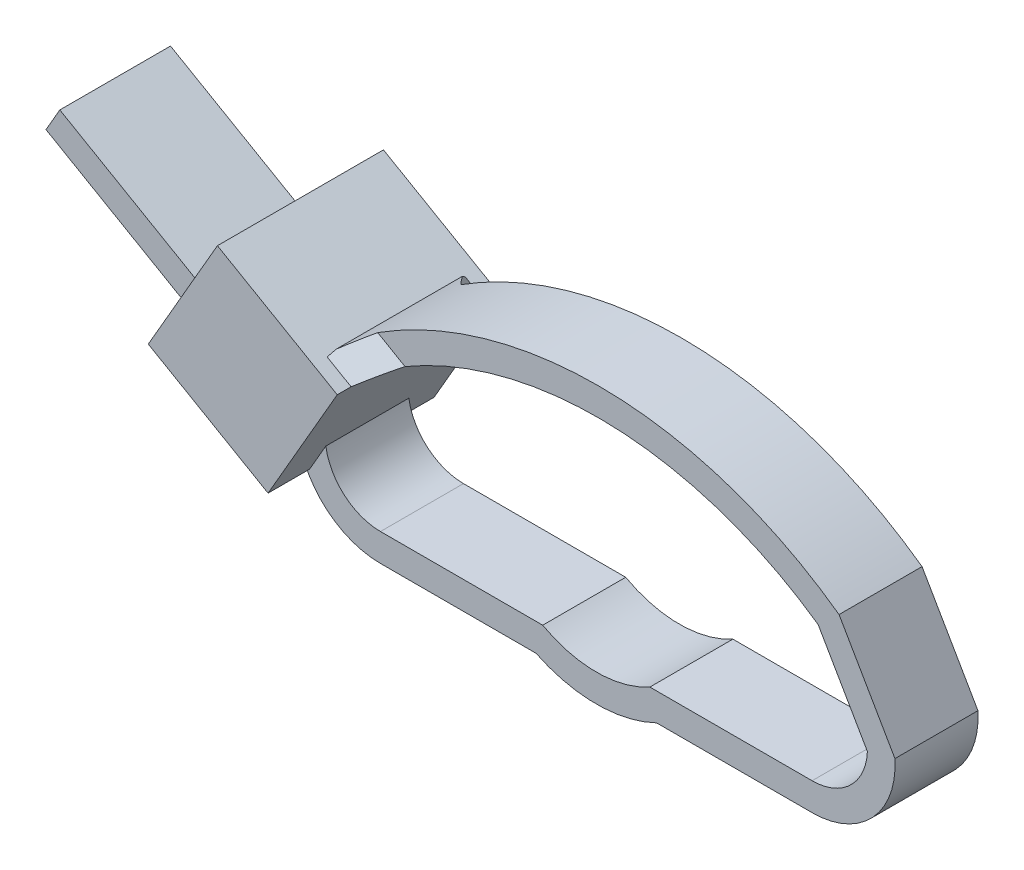
ISO-10303-21;
HEADER;
FILE_DESCRIPTION(('STEP AP214'),'2;1');
FILE_NAME('part.step','',(''),(''),'','','');
FILE_SCHEMA(('AUTOMOTIVE_DESIGN { 1 0 10303 214 1 1 1 1 }'));
ENDSEC;
DATA;
#1=APPLICATION_CONTEXT('core data for automotive mechanical design processes');
#2=APPLICATION_PROTOCOL_DEFINITION('international standard','automotive_design',2000,#1);
#3=PRODUCT_CONTEXT('',#1,'mechanical');
#4=PRODUCT('Part','Part','',(#3));
#5=PRODUCT_RELATED_PRODUCT_CATEGORY('part','',(#4));
#6=PRODUCT_DEFINITION_FORMATION('','',#4);
#7=PRODUCT_DEFINITION_CONTEXT('part definition',#1,'design');
#8=PRODUCT_DEFINITION('design','',#6,#7);
#9=PRODUCT_DEFINITION_SHAPE('','',#8);
#10=(LENGTH_UNIT() NAMED_UNIT(*) SI_UNIT(.MILLI.,.METRE.));
#11=(NAMED_UNIT(*) PLANE_ANGLE_UNIT() SI_UNIT($,.RADIAN.));
#12=(NAMED_UNIT(*) SI_UNIT($,.STERADIAN.) SOLID_ANGLE_UNIT());
#13=UNCERTAINTY_MEASURE_WITH_UNIT(LENGTH_MEASURE(1.E-05),#10,'distance_accuracy_value','');
#14=(GEOMETRIC_REPRESENTATION_CONTEXT(3) GLOBAL_UNCERTAINTY_ASSIGNED_CONTEXT((#13)) GLOBAL_UNIT_ASSIGNED_CONTEXT((#10,
#11,#12)) REPRESENTATION_CONTEXT('',''));
#15=CARTESIAN_POINT('',(0.,0.,0.));
#16=DIRECTION('',(0.,0.,1.));
#17=DIRECTION('',(1.,0.,0.));
#18=AXIS2_PLACEMENT_3D('',#15,#16,#17);
#19=CARTESIAN_POINT('',(-15.4229128114991,8.90442286340706,3.));
#20=DIRECTION('',(0.866025403784441,-0.499999999999996,0.));
#21=DIRECTION('',(0.499999999999996,0.866025403784441,0.));
#22=AXIS2_PLACEMENT_3D('',#19,#20,#21);
#23=PLANE('',#22);
#24=DIRECTION('',(-0.499999999999996,-0.866025403784441,0.));
#25=VECTOR('',#24,1.);
#26=CARTESIAN_POINT('',(-15.4229128114991,8.90442286340706,-3.));
#27=LINE('',#26,#25);
#28=CARTESIAN_POINT('',(-12.1923048454154,14.5000000000009,-3.));
#29=VERTEX_POINT('',#28);
#30=CARTESIAN_POINT('',(-14.6923048454154,10.1698729810787,-3.));
#31=VERTEX_POINT('',#30);
#32=EDGE_CURVE('E346',#29,#31,#27,.T.);
#33=ORIENTED_EDGE('',*,*,#32,.T.);
#34=DIRECTION('',(0.,0.,-1.));
#35=VECTOR('',#34,1.);
#36=CARTESIAN_POINT('',(-14.6923048454154,10.1698729810787,3.));
#37=LINE('',#36,#35);
#38=CARTESIAN_POINT('',(-14.6923048454154,10.1698729810787,3.));
#39=VERTEX_POINT('',#38);
#40=EDGE_CURVE('E355',#39,#31,#37,.T.);
#41=ORIENTED_EDGE('',*,*,#40,.F.);
#42=DIRECTION('',(-0.499999999999996,-0.866025403784441,0.));
#43=VECTOR('',#42,1.);
#44=CARTESIAN_POINT('',(-15.4229128114991,8.90442286340706,3.));
#45=LINE('',#44,#43);
#46=CARTESIAN_POINT('',(-12.1923048454154,14.5000000000009,3.));
#47=VERTEX_POINT('',#46);
#48=EDGE_CURVE('E352',#47,#39,#45,.T.);
#49=ORIENTED_EDGE('',*,*,#48,.F.);
#50=DIRECTION('',(0.,0.,-1.));
#51=VECTOR('',#50,1.);
#52=CARTESIAN_POINT('',(-12.1923048454154,14.5000000000009,3.));
#53=LINE('',#52,#51);
#54=EDGE_CURVE('E368',#47,#29,#53,.T.);
#55=ORIENTED_EDGE('',*,*,#54,.T.);
#56=EDGE_LOOP('',(#33,#41,#49,#55));
#57=FACE_BOUND('',#56,.T.);
#58=DIRECTION('',(-0.499999999999996,-0.866025403784441,0.));
#59=VECTOR('',#58,1.);
#60=CARTESIAN_POINT('',(-15.4229128114991,8.90442286340707,-2.));
#61=LINE('',#60,#59);
#62=CARTESIAN_POINT('',(-13.6923048454154,11.9019237886476,-2.));
#63=VERTEX_POINT('',#62);
#64=CARTESIAN_POINT('',(-14.1923048454154,11.0358983848632,-2.));
#65=VERTEX_POINT('',#64);
#66=EDGE_CURVE('E322',#63,#65,#61,.T.);
#67=ORIENTED_EDGE('',*,*,#66,.F.);
#68=DIRECTION('',(-0.499999999999996,-0.866025403784441,0.));
#69=VECTOR('',#68,1.);
#70=CARTESIAN_POINT('',(-15.4229128114991,8.90442286340707,-2.));
#71=LINE('',#70,#69);
#72=CARTESIAN_POINT('',(-12.6923048454154,13.6339745962165,-2.));
#73=VERTEX_POINT('',#72);
#74=EDGE_CURVE('E290',#73,#63,#71,.T.);
#75=ORIENTED_EDGE('',*,*,#74,.F.);
#76=DIRECTION('',(0.,0.,-1.));
#77=VECTOR('',#76,1.);
#78=CARTESIAN_POINT('',(-12.6923048454154,13.6339745962165,0.));
#79=LINE('',#78,#77);
#80=CARTESIAN_POINT('',(-12.6923048454154,13.6339745962165,2.));
#81=VERTEX_POINT('',#80);
#82=EDGE_CURVE('E305',#81,#73,#79,.T.);
#83=ORIENTED_EDGE('',*,*,#82,.F.);
#84=DIRECTION('',(0.499999999999996,0.866025403784441,0.));
#85=VECTOR('',#84,1.);
#86=CARTESIAN_POINT('',(-15.4229128114991,8.90442286340707,2.));
#87=LINE('',#86,#85);
#88=CARTESIAN_POINT('',(-13.6923048454154,11.9019237886476,2.));
#89=VERTEX_POINT('',#88);
#90=EDGE_CURVE('E862',#89,#81,#87,.T.);
#91=ORIENTED_EDGE('',*,*,#90,.F.);
#92=DIRECTION('',(0.499999999999996,0.866025403784441,0.));
#93=VECTOR('',#92,1.);
#94=CARTESIAN_POINT('',(-15.4229128114991,8.90442286340707,2.));
#95=LINE('',#94,#93);
#96=CARTESIAN_POINT('',(-14.1923048454154,11.0358983848632,2.));
#97=VERTEX_POINT('',#96);
#98=EDGE_CURVE('E319',#97,#89,#95,.T.);
#99=ORIENTED_EDGE('',*,*,#98,.F.);
#100=DIRECTION('',(0.,0.,1.));
#101=VECTOR('',#100,1.);
#102=CARTESIAN_POINT('',(-14.1923048454154,11.0358983848632,0.));
#103=LINE('',#102,#101);
#104=EDGE_CURVE('E325',#65,#97,#103,.T.);
#105=ORIENTED_EDGE('',*,*,#104,.F.);
#106=EDGE_LOOP('',(#67,#75,#83,#91,#99,#105));
#107=FACE_BOUND('',#106,.T.);
#108=ADVANCED_FACE('F34',(#57,#107),#23,.F.);
#109=CARTESIAN_POINT('',(7.8,9.00000000000125,1.5));
#110=DIRECTION('',(0.,0.,-1.));
#111=DIRECTION('',(-1.,0.,0.));
#112=AXIS2_PLACEMENT_3D('',#109,#110,#111);
#113=CYLINDRICAL_SURFACE('',#112,2.00000000000136);
#114=CARTESIAN_POINT('',(7.8,9.00000000000125,-1.5));
#115=DIRECTION('',(0.,0.,1.));
#116=DIRECTION('',(1.,0.,0.));
#117=AXIS2_PLACEMENT_3D('',#114,#115,#116);
#118=CIRCLE('',#117,2.00000000000136);
#119=CARTESIAN_POINT('',(7.8,6.99999999999976,-1.5));
#120=VERTEX_POINT('',#119);
#121=CARTESIAN_POINT('',(9.79817994304529,8.91469516299627,-1.5));
#122=VERTEX_POINT('',#121);
#123=EDGE_CURVE('E165',#120,#122,#118,.T.);
#124=ORIENTED_EDGE('',*,*,#123,.F.);
#125=DIRECTION('',(0.,0.,-1.));
#126=VECTOR('',#125,1.);
#127=CARTESIAN_POINT('',(7.8,6.99999999999976,1.5));
#128=LINE('',#127,#126);
#129=CARTESIAN_POINT('',(7.8,6.99999999999976,1.5));
#130=VERTEX_POINT('',#129);
#131=EDGE_CURVE('E123',#130,#120,#128,.T.);
#132=ORIENTED_EDGE('',*,*,#131,.F.);
#133=CARTESIAN_POINT('',(7.8,9.00000000000125,1.5));
#134=DIRECTION('',(0.,0.,1.));
#135=DIRECTION('',(1.,0.,0.));
#136=AXIS2_PLACEMENT_3D('',#133,#134,#135);
#137=CIRCLE('',#136,2.00000000000136);
#138=CARTESIAN_POINT('',(9.79817994304529,8.91469516299627,1.5));
#139=VERTEX_POINT('',#138);
#140=EDGE_CURVE('E211',#130,#139,#137,.T.);
#141=ORIENTED_EDGE('',*,*,#140,.T.);
#142=DIRECTION('',(0.,0.,-1.));
#143=VECTOR('',#142,1.);
#144=CARTESIAN_POINT('',(9.79817994304529,8.91469516299627,1.5));
#145=LINE('',#144,#143);
#146=EDGE_CURVE('E164',#139,#122,#145,.T.);
#147=ORIENTED_EDGE('',*,*,#146,.T.);
#148=EDGE_LOOP('',(#124,#132,#141,#147));
#149=FACE_BOUND('',#148,.T.);
#150=ADVANCED_FACE('F271',(#149),#113,.F.);
#151=CARTESIAN_POINT('',(0.,6.99999999999977,1.5));
#152=DIRECTION('',(0.,-1.,0.));
#153=DIRECTION('',(1.,0.,0.));
#154=AXIS2_PLACEMENT_3D('',#151,#152,#153);
#155=PLANE('',#154);
#156=DIRECTION('',(-1.,0.,0.));
#157=VECTOR('',#156,1.);
#158=CARTESIAN_POINT('',(0.,6.99999999999977,-1.5));
#159=LINE('',#158,#157);
#160=CARTESIAN_POINT('',(1.93649167310428,6.99999999999976,-1.5));
#161=VERTEX_POINT('',#160);
#162=EDGE_CURVE('E168',#120,#161,#159,.T.);
#163=ORIENTED_EDGE('',*,*,#162,.T.);
#164=DIRECTION('',(0.,0.,-1.));
#165=VECTOR('',#164,1.);
#166=CARTESIAN_POINT('',(1.93649167310428,6.99999999999976,1.5));
#167=LINE('',#166,#165);
#168=CARTESIAN_POINT('',(1.93649167310428,6.99999999999976,1.5));
#169=VERTEX_POINT('',#168);
#170=EDGE_CURVE('E244',#169,#161,#167,.T.);
#171=ORIENTED_EDGE('',*,*,#170,.F.);
#172=DIRECTION('',(-1.,0.,0.));
#173=VECTOR('',#172,1.);
#174=CARTESIAN_POINT('',(0.,6.99999999999977,1.5));
#175=LINE('',#174,#173);
#176=EDGE_CURVE('E257',#130,#169,#175,.T.);
#177=ORIENTED_EDGE('',*,*,#176,.F.);
#178=ORIENTED_EDGE('',*,*,#131,.T.);
#179=EDGE_LOOP('',(#163,#171,#177,#178));
#180=FACE_BOUND('',#179,.T.);
#181=ADVANCED_FACE('F252',(#180),#155,.F.);
#182=CARTESIAN_POINT('',(1.645385216964E-12,10.4999999999976,1.5));
#183=DIRECTION('',(0.,0.,-1.));
#184=DIRECTION('',(-1.,0.,0.));
#185=AXIS2_PLACEMENT_3D('',#182,#183,#184);
#186=CYLINDRICAL_SURFACE('',#185,3.99999999999756);
#187=CARTESIAN_POINT('',(1.645385216964E-12,10.4999999999976,-1.5));
#188=DIRECTION('',(0.,0.,1.));
#189=DIRECTION('',(1.,0.,0.));
#190=AXIS2_PLACEMENT_3D('',#187,#188,#189);
#191=CIRCLE('',#190,3.99999999999756);
#192=CARTESIAN_POINT('',(-1.93649167310099,6.99999999999977,-1.5));
#193=VERTEX_POINT('',#192);
#194=EDGE_CURVE('E172',#193,#161,#191,.T.);
#195=ORIENTED_EDGE('',*,*,#194,.F.);
#196=DIRECTION('',(0.,0.,-1.));
#197=VECTOR('',#196,1.);
#198=CARTESIAN_POINT('',(-1.93649167310099,6.99999999999977,1.5));
#199=LINE('',#198,#197);
#200=CARTESIAN_POINT('',(-1.93649167310099,6.99999999999977,1.5));
#201=VERTEX_POINT('',#200);
#202=EDGE_CURVE('E241',#201,#193,#199,.T.);
#203=ORIENTED_EDGE('',*,*,#202,.F.);
#204=CARTESIAN_POINT('',(1.645385216964E-12,10.4999999999976,1.5));
#205=DIRECTION('',(0.,0.,1.));
#206=DIRECTION('',(1.,0.,0.));
#207=AXIS2_PLACEMENT_3D('',#204,#205,#206);
#208=CIRCLE('',#207,3.99999999999756);
#209=EDGE_CURVE('E379',#201,#169,#208,.T.);
#210=ORIENTED_EDGE('',*,*,#209,.T.);
#211=ORIENTED_EDGE('',*,*,#170,.T.);
#212=EDGE_LOOP('',(#195,#203,#210,#211));
#213=FACE_BOUND('',#212,.T.);
#214=ADVANCED_FACE('F528',(#213),#186,.F.);
#215=CARTESIAN_POINT('',(0.,6.99999999999977,1.5));
#216=DIRECTION('',(0.,-1.,0.));
#217=DIRECTION('',(0.,0.,-1.));
#218=AXIS2_PLACEMENT_3D('',#215,#216,#217);
#219=PLANE('',#218);
#220=DIRECTION('',(-1.,0.,0.));
#221=VECTOR('',#220,1.);
#222=CARTESIAN_POINT('',(0.,6.99999999999977,-1.5));
#223=LINE('',#222,#221);
#224=CARTESIAN_POINT('',(-7.8,6.99999999999977,-1.5));
#225=VERTEX_POINT('',#224);
#226=EDGE_CURVE('E175',#193,#225,#223,.T.);
#227=ORIENTED_EDGE('',*,*,#226,.T.);
#228=DIRECTION('',(0.,0.,-1.));
#229=VECTOR('',#228,1.);
#230=CARTESIAN_POINT('',(-7.8,6.99999999999977,1.5));
#231=LINE('',#230,#229);
#232=CARTESIAN_POINT('',(-7.8,6.99999999999977,1.5));
#233=VERTEX_POINT('',#232);
#234=EDGE_CURVE('E238',#233,#225,#231,.T.);
#235=ORIENTED_EDGE('',*,*,#234,.F.);
#236=DIRECTION('',(-1.,0.,0.));
#237=VECTOR('',#236,1.);
#238=CARTESIAN_POINT('',(0.,6.99999999999977,1.5));
#239=LINE('',#238,#237);
#240=EDGE_CURVE('E382',#201,#233,#239,.T.);
#241=ORIENTED_EDGE('',*,*,#240,.F.);
#242=ORIENTED_EDGE('',*,*,#202,.T.);
#243=EDGE_LOOP('',(#227,#235,#241,#242));
#244=FACE_BOUND('',#243,.T.);
#245=ADVANCED_FACE('F529',(#244),#219,.F.);
#246=CARTESIAN_POINT('',(-7.8,9.,1.5));
#247=DIRECTION('',(0.,0.,-1.));
#248=DIRECTION('',(-1.,0.,0.));
#249=AXIS2_PLACEMENT_3D('',#246,#247,#248);
#250=CYLINDRICAL_SURFACE('',#249,2.00000000000017);
#251=CARTESIAN_POINT('',(-7.8,9.,-1.5));
#252=DIRECTION('',(0.,0.,1.));
#253=DIRECTION('',(1.,0.,0.));
#254=AXIS2_PLACEMENT_3D('',#251,#252,#253);
#255=CIRCLE('',#254,2.00000000000017);
#256=CARTESIAN_POINT('',(-9.77526612818721,8.68643386210124,-1.5));
#257=VERTEX_POINT('',#256);
#258=EDGE_CURVE('E178',#257,#225,#255,.T.);
#259=ORIENTED_EDGE('',*,*,#258,.F.);
#260=DIRECTION('',(0.,0.,-1.));
#261=VECTOR('',#260,1.);
#262=CARTESIAN_POINT('',(-9.77526612818721,8.68643386210124,1.5));
#263=LINE('',#262,#261);
#264=CARTESIAN_POINT('',(-9.77526612818725,8.68643386210115,1.5));
#265=VERTEX_POINT('',#264);
#266=EDGE_CURVE('E235',#265,#257,#263,.T.);
#267=ORIENTED_EDGE('',*,*,#266,.F.);
#268=CARTESIAN_POINT('',(-7.8,9.,1.5));
#269=DIRECTION('',(0.,0.,1.));
#270=DIRECTION('',(1.,0.,0.));
#271=AXIS2_PLACEMENT_3D('',#268,#269,#270);
#272=CIRCLE('',#271,2.00000000000017);
#273=EDGE_CURVE('E385',#265,#233,#272,.T.);
#274=ORIENTED_EDGE('',*,*,#273,.T.);
#275=ORIENTED_EDGE('',*,*,#234,.T.);
#276=EDGE_LOOP('',(#259,#267,#274,#275));
#277=FACE_BOUND('',#276,.T.);
#278=ADVANCED_FACE('F525',(#277),#250,.F.);
#279=CARTESIAN_POINT('',(-7.8,9.,1.5));
#280=DIRECTION('',(0.,0.,-1.));
#281=DIRECTION('',(-1.,0.,0.));
#282=AXIS2_PLACEMENT_3D('',#279,#280,#281);
#283=CYLINDRICAL_SURFACE('',#282,3.0000000000002);
#284=CARTESIAN_POINT('',(-7.8,9.,-1.5));
#285=DIRECTION('',(0.,0.,1.));
#286=DIRECTION('',(1.,0.,0.));
#287=AXIS2_PLACEMENT_3D('',#284,#285,#286);
#288=CIRCLE('',#287,3.0000000000002);
#289=CARTESIAN_POINT('',(-10.5364855923582,7.77050961662281,-1.5));
#290=VERTEX_POINT('',#289);
#291=CARTESIAN_POINT('',(-7.8,5.99999999999976,-1.5));
#292=VERTEX_POINT('',#291);
#293=EDGE_CURVE('E187',#290,#292,#288,.T.);
#294=ORIENTED_EDGE('',*,*,#293,.T.);
#295=DIRECTION('',(0.,0.,-1.));
#296=VECTOR('',#295,1.);
#297=CARTESIAN_POINT('',(-7.8,5.99999999999976,1.5));
#298=LINE('',#297,#296);
#299=CARTESIAN_POINT('',(-7.8,5.99999999999976,1.5));
#300=VERTEX_POINT('',#299);
#301=EDGE_CURVE('E229',#300,#292,#298,.T.);
#302=ORIENTED_EDGE('',*,*,#301,.F.);
#303=CARTESIAN_POINT('',(-7.8,9.,1.5));
#304=DIRECTION('',(0.,0.,1.));
#305=DIRECTION('',(1.,0.,0.));
#306=AXIS2_PLACEMENT_3D('',#303,#304,#305);
#307=CIRCLE('',#306,3.0000000000002);
#308=CARTESIAN_POINT('',(-10.5364855923582,7.77050961662281,1.5));
#309=VERTEX_POINT('',#308);
#310=EDGE_CURVE('E394',#309,#300,#307,.T.);
#311=ORIENTED_EDGE('',*,*,#310,.F.);
#312=DIRECTION('',(0.,0.,-1.));
#313=VECTOR('',#312,1.);
#314=CARTESIAN_POINT('',(-10.5364855923582,7.77050961662281,1.5));
#315=LINE('',#314,#313);
#316=EDGE_CURVE('E232',#309,#290,#315,.T.);
#317=ORIENTED_EDGE('',*,*,#316,.T.);
#318=EDGE_LOOP('',(#294,#302,#311,#317));
#319=FACE_BOUND('',#318,.T.);
#320=ADVANCED_FACE('F512',(#319),#283,.T.);
#321=CARTESIAN_POINT('',(0.,5.99999999999976,1.5));
#322=DIRECTION('',(0.,-1.,0.));
#323=DIRECTION('',(0.,0.,-1.));
#324=AXIS2_PLACEMENT_3D('',#321,#322,#323);
#325=PLANE('',#324);
#326=DIRECTION('',(-1.,0.,0.));
#327=VECTOR('',#326,1.);
#328=CARTESIAN_POINT('',(0.,5.99999999999976,-1.5));
#329=LINE('',#328,#327);
#330=CARTESIAN_POINT('',(-2.17944947176763,5.99999999999976,-1.5));
#331=VERTEX_POINT('',#330);
#332=EDGE_CURVE('E190',#331,#292,#329,.T.);
#333=ORIENTED_EDGE('',*,*,#332,.F.);
#334=DIRECTION('',(0.,0.,-1.));
#335=VECTOR('',#334,1.);
#336=CARTESIAN_POINT('',(-2.17944947176763,5.99999999999976,1.5));
#337=LINE('',#336,#335);
#338=CARTESIAN_POINT('',(-2.17944947176763,5.99999999999976,1.5));
#339=VERTEX_POINT('',#338);
#340=EDGE_CURVE('E226',#339,#331,#337,.T.);
#341=ORIENTED_EDGE('',*,*,#340,.F.);
#342=DIRECTION('',(-1.,0.,0.));
#343=VECTOR('',#342,1.);
#344=CARTESIAN_POINT('',(0.,5.99999999999976,1.5));
#345=LINE('',#344,#343);
#346=EDGE_CURVE('E397',#339,#300,#345,.T.);
#347=ORIENTED_EDGE('',*,*,#346,.T.);
#348=ORIENTED_EDGE('',*,*,#301,.T.);
#349=EDGE_LOOP('',(#333,#341,#347,#348));
#350=FACE_BOUND('',#349,.T.);
#351=ADVANCED_FACE('F503',(#350),#325,.T.);
#352=CARTESIAN_POINT('',(1.645385216964E-12,10.4999999999976,1.5));
#353=DIRECTION('',(0.,0.,-1.));
#354=DIRECTION('',(-1.,0.,0.));
#355=AXIS2_PLACEMENT_3D('',#352,#353,#354);
#356=CYLINDRICAL_SURFACE('',#355,4.99999999999756);
#357=CARTESIAN_POINT('',(1.645385216964E-12,10.4999999999976,-1.5));
#358=DIRECTION('',(0.,0.,1.));
#359=DIRECTION('',(1.,0.,0.));
#360=AXIS2_PLACEMENT_3D('',#357,#358,#359);
#361=CIRCLE('',#360,4.99999999999756);
#362=CARTESIAN_POINT('',(2.17944947177092,5.99999999999977,-1.5));
#363=VERTEX_POINT('',#362);
#364=EDGE_CURVE('E193',#331,#363,#361,.T.);
#365=ORIENTED_EDGE('',*,*,#364,.T.);
#366=DIRECTION('',(0.,0.,-1.));
#367=VECTOR('',#366,1.);
#368=CARTESIAN_POINT('',(2.17944947177092,5.99999999999977,1.5));
#369=LINE('',#368,#367);
#370=CARTESIAN_POINT('',(2.17944947177092,5.99999999999977,1.5));
#371=VERTEX_POINT('',#370);
#372=EDGE_CURVE('E223',#371,#363,#369,.T.);
#373=ORIENTED_EDGE('',*,*,#372,.F.);
#374=CARTESIAN_POINT('',(1.645385216964E-12,10.4999999999976,1.5));
#375=DIRECTION('',(0.,0.,1.));
#376=DIRECTION('',(1.,0.,0.));
#377=AXIS2_PLACEMENT_3D('',#374,#375,#376);
#378=CIRCLE('',#377,4.99999999999756);
#379=EDGE_CURVE('E400',#339,#371,#378,.T.);
#380=ORIENTED_EDGE('',*,*,#379,.F.);
#381=ORIENTED_EDGE('',*,*,#340,.T.);
#382=EDGE_LOOP('',(#365,#373,#380,#381));
#383=FACE_BOUND('',#382,.T.);
#384=ADVANCED_FACE('F506',(#383),#356,.T.);
#385=CARTESIAN_POINT('',(0.,5.99999999999977,1.5));
#386=DIRECTION('',(0.,-1.,0.));
#387=DIRECTION('',(1.,0.,0.));
#388=AXIS2_PLACEMENT_3D('',#385,#386,#387);
#389=PLANE('',#388);
#390=DIRECTION('',(-1.,0.,0.));
#391=VECTOR('',#390,1.);
#392=CARTESIAN_POINT('',(0.,5.99999999999977,-1.5));
#393=LINE('',#392,#391);
#394=CARTESIAN_POINT('',(7.8,5.99999999999976,-1.5));
#395=VERTEX_POINT('',#394);
#396=EDGE_CURVE('E196',#395,#363,#393,.T.);
#397=ORIENTED_EDGE('',*,*,#396,.F.);
#398=DIRECTION('',(0.,0.,-1.));
#399=VECTOR('',#398,1.);
#400=CARTESIAN_POINT('',(7.8,5.99999999999976,1.5));
#401=LINE('',#400,#399);
#402=CARTESIAN_POINT('',(7.8,5.99999999999976,1.5));
#403=VERTEX_POINT('',#402);
#404=EDGE_CURVE('E220',#403,#395,#401,.T.);
#405=ORIENTED_EDGE('',*,*,#404,.F.);
#406=DIRECTION('',(-1.,0.,0.));
#407=VECTOR('',#406,1.);
#408=CARTESIAN_POINT('',(0.,5.99999999999977,1.5));
#409=LINE('',#408,#407);
#410=EDGE_CURVE('E159',#403,#371,#409,.T.);
#411=ORIENTED_EDGE('',*,*,#410,.T.);
#412=ORIENTED_EDGE('',*,*,#372,.T.);
#413=EDGE_LOOP('',(#397,#405,#411,#412));
#414=FACE_BOUND('',#413,.T.);
#415=ADVANCED_FACE('F407',(#414),#389,.T.);
#416=CARTESIAN_POINT('',(7.8,9.00000000000125,1.5));
#417=DIRECTION('',(0.,0.,-1.));
#418=DIRECTION('',(-1.,0.,0.));
#419=AXIS2_PLACEMENT_3D('',#416,#417,#418);
#420=CYLINDRICAL_SURFACE('',#419,3.00000000000142);
#421=CARTESIAN_POINT('',(7.8,9.00000000000125,-1.5));
#422=DIRECTION('',(0.,0.,1.));
#423=DIRECTION('',(1.,0.,0.));
#424=AXIS2_PLACEMENT_3D('',#421,#422,#423);
#425=CIRCLE('',#424,3.00000000000142);
#426=CARTESIAN_POINT('',(10.7939827358654,9.18991413151276,-1.5));
#427=VERTEX_POINT('',#426);
#428=EDGE_CURVE('E199',#395,#427,#425,.T.);
#429=ORIENTED_EDGE('',*,*,#428,.T.);
#430=DIRECTION('',(0.,0.,-1.));
#431=VECTOR('',#430,1.);
#432=CARTESIAN_POINT('',(10.7939827358654,9.18991413151276,1.5));
#433=LINE('',#432,#431);
#434=CARTESIAN_POINT('',(10.7939827358654,9.18991413151276,1.5));
#435=VERTEX_POINT('',#434);
#436=EDGE_CURVE('E151',#435,#427,#433,.T.);
#437=ORIENTED_EDGE('',*,*,#436,.F.);
#438=CARTESIAN_POINT('',(7.8,9.00000000000125,1.5));
#439=DIRECTION('',(0.,0.,1.));
#440=DIRECTION('',(1.,0.,0.));
#441=AXIS2_PLACEMENT_3D('',#438,#439,#440);
#442=CIRCLE('',#441,3.00000000000142);
#443=EDGE_CURVE('E156',#403,#435,#442,.T.);
#444=ORIENTED_EDGE('',*,*,#443,.F.);
#445=ORIENTED_EDGE('',*,*,#404,.T.);
#446=EDGE_LOOP('',(#429,#437,#444,#445));
#447=FACE_BOUND('',#446,.T.);
#448=ADVANCED_FACE('F436',(#447),#420,.T.);
#449=CARTESIAN_POINT('',(12.0748366001429,6.97141016151325,1.5));
#450=DIRECTION('',(0.866025403784439,0.499999999999999,0.));
#451=DIRECTION('',(-0.499999999999999,0.866025403784439,0.));
#452=AXIS2_PLACEMENT_3D('',#449,#450,#451);
#453=PLANE('',#452);
#454=DIRECTION('',(0.499999999999999,-0.866025403784439,0.));
#455=VECTOR('',#454,1.);
#456=CARTESIAN_POINT('',(12.0748366001429,6.97141016151325,-1.5));
#457=LINE('',#456,#455);
#458=CARTESIAN_POINT('',(8.77390095808607,12.6887984060707,-1.5));
#459=VERTEX_POINT('',#458);
#460=EDGE_CURVE('E150',#459,#427,#457,.T.);
#461=ORIENTED_EDGE('',*,*,#460,.F.);
#462=DIRECTION('',(0.,0.,-1.));
#463=VECTOR('',#462,1.);
#464=CARTESIAN_POINT('',(8.77390095808607,12.6887984060707,1.5));
#465=LINE('',#464,#463);
#466=CARTESIAN_POINT('',(8.77390095808607,12.6887984060707,1.5));
#467=VERTEX_POINT('',#466);
#468=EDGE_CURVE('E139',#467,#459,#465,.T.);
#469=ORIENTED_EDGE('',*,*,#468,.F.);
#470=DIRECTION('',(0.499999999999999,-0.866025403784439,0.));
#471=VECTOR('',#470,1.);
#472=CARTESIAN_POINT('',(12.0748366001429,6.97141016151325,1.5));
#473=LINE('',#472,#471);
#474=EDGE_CURVE('E143',#467,#435,#473,.T.);
#475=ORIENTED_EDGE('',*,*,#474,.T.);
#476=ORIENTED_EDGE('',*,*,#436,.T.);
#477=EDGE_LOOP('',(#461,#469,#475,#476));
#478=FACE_BOUND('',#477,.T.);
#479=ADVANCED_FACE('F147',(#478),#453,.T.);
#480=CARTESIAN_POINT('',(0.0773502691877002,0.644460989936353,1.5));
#481=DIRECTION('',(0.,0.,-1.));
#482=DIRECTION('',(-1.,0.,0.));
#483=AXIS2_PLACEMENT_3D('',#480,#481,#482);
#484=CYLINDRICAL_SURFACE('',#483,14.8558425435339);
#485=CARTESIAN_POINT('',(0.0773502691877002,0.644460989936353,-1.5));
#486=DIRECTION('',(0.,0.,1.));
#487=DIRECTION('',(1.,0.,0.));
#488=AXIS2_PLACEMENT_3D('',#485,#486,#487);
#489=CIRCLE('',#488,14.8558425435339);
#490=CARTESIAN_POINT('',(-7.90016455542527,13.1766321865548,-1.5));
#491=VERTEX_POINT('',#490);
#492=EDGE_CURVE('E203',#491,#459,#489,.F.);
#493=ORIENTED_EDGE('',*,*,#492,.F.);
#494=CARTESIAN_POINT('',(0.0773502691877002,0.644460989936353,-8.36442120854069));
#495=DIRECTION('',(0.35355339059327,0.612372435695792,-0.707106781186551));
#496=DIRECTION('',(-0.353553390593274,-0.612372435695799,-0.707106781186544));
#497=AXIS2_PLACEMENT_3D('',#494,#495,#496);
#498=ELLIPSE('',#497,21.0093340055448,14.8558425435339);
#499=CARTESIAN_POINT('',(-8.61920041971067,12.6887984060707,-2.2819943788661));
#500=VERTEX_POINT('',#499);
#501=EDGE_CURVE('E78',#491,#500,#498,.F.);
#502=ORIENTED_EDGE('',*,*,#501,.T.);
#503=DIRECTION('',(0.,0.,-1.));
#504=VECTOR('',#503,1.);
#505=CARTESIAN_POINT('',(-8.61920041971067,12.6887984060707,1.5));
#506=LINE('',#505,#504);
#507=CARTESIAN_POINT('',(-8.61920041971067,12.6887984060707,2.28199437886611));
#508=VERTEX_POINT('',#507);
#509=EDGE_CURVE('E58',#508,#500,#506,.T.);
#510=ORIENTED_EDGE('',*,*,#509,.F.);
#511=CARTESIAN_POINT('',(0.0773502691877002,0.644460989936353,8.36442120854084));
#512=DIRECTION('',(-0.353553390593274,-0.6123724356958,-0.707106781186543));
#513=DIRECTION('',(0.353553390593269,0.612372435695792,-0.707106781186552));
#514=AXIS2_PLACEMENT_3D('',#511,#512,#513);
#515=ELLIPSE('',#514,21.009334005545,14.8558425435339);
#516=CARTESIAN_POINT('',(-7.90016455542529,13.1766321865548,1.5));
#517=VERTEX_POINT('',#516);
#518=EDGE_CURVE('E42',#508,#517,#515,.T.);
#519=ORIENTED_EDGE('',*,*,#518,.T.);
#520=CARTESIAN_POINT('',(0.0773502691877002,0.644460989936353,1.5));
#521=DIRECTION('',(0.,0.,1.));
#522=DIRECTION('',(1.,0.,0.));
#523=AXIS2_PLACEMENT_3D('',#520,#521,#522);
#524=CIRCLE('',#523,14.8558425435339);
#525=EDGE_CURVE('E101',#517,#467,#524,.F.);
#526=ORIENTED_EDGE('',*,*,#525,.T.);
#527=ORIENTED_EDGE('',*,*,#468,.T.);
#528=EDGE_LOOP('',(#493,#502,#510,#519,#526,#527));
#529=FACE_BOUND('',#528,.T.);
#530=ADVANCED_FACE('F134',(#529),#484,.T.);
#531=CARTESIAN_POINT('',(-11.9588111963614,6.90442286340714,1.5));
#532=DIRECTION('',(-0.866025403784439,0.5,0.));
#533=DIRECTION('',(-0.5,-0.866025403784439,0.));
#534=AXIS2_PLACEMENT_3D('',#531,#532,#533);
#535=PLANE('',#534);
#536=ORIENTED_EDGE('',*,*,#509,.T.);
#537=DIRECTION('',(0.353553390593276,0.612372435695798,0.707106781186544));
#538=VECTOR('',#537,1.);
#539=CARTESIAN_POINT('',(-8.2282032302776,13.3660254037854,-1.49999999999998));
#540=LINE('',#539,#538);
#541=CARTESIAN_POINT('',(-8.72820323027761,12.500000000001,-2.5));
#542=VERTEX_POINT('',#541);
#543=EDGE_CURVE('E128',#500,#542,#540,.F.);
#544=ORIENTED_EDGE('',*,*,#543,.T.);
#545=DIRECTION('',(0.,0.,-1.));
#546=VECTOR('',#545,1.);
#547=CARTESIAN_POINT('',(-8.72820323027761,12.500000000001,1.5));
#548=LINE('',#547,#546);
#549=CARTESIAN_POINT('',(-8.72820323027761,12.500000000001,2.50000000000001));
#550=VERTEX_POINT('',#549);
#551=EDGE_CURVE('E216',#550,#542,#548,.T.);
#552=ORIENTED_EDGE('',*,*,#551,.F.);
#553=DIRECTION('',(0.353553390593271,0.612372435695791,-0.707106781186552));
#554=VECTOR('',#553,1.);
#555=CARTESIAN_POINT('',(-8.7282032302776,12.500000000001,2.49999999999999));
#556=LINE('',#555,#554);
#557=EDGE_CURVE('E118',#550,#508,#556,.T.);
#558=ORIENTED_EDGE('',*,*,#557,.T.);
#559=EDGE_LOOP('',(#536,#544,#552,#558));
#560=FACE_BOUND('',#559,.T.);
#561=ADVANCED_FACE('F441',(#560),#535,.T.);
#562=CARTESIAN_POINT('',(0.0773502691877002,0.644460989936353,1.5));
#563=DIRECTION('',(0.,0.,-1.));
#564=DIRECTION('',(-1.,0.,0.));
#565=AXIS2_PLACEMENT_3D('',#562,#563,#564);
#566=CYLINDRICAL_SURFACE('',#565,13.8558425435339);
#567=DIRECTION('',(0.,0.,-1.));
#568=VECTOR('',#567,1.);
#569=CARTESIAN_POINT('',(-7.86217782649317,12.000000000001,1.5));
#570=LINE('',#569,#568);
#571=CARTESIAN_POINT('',(-7.86217782649317,12.000000000001,2.50000000000001));
#572=VERTEX_POINT('',#571);
#573=CARTESIAN_POINT('',(-7.86217782649317,12.000000000001,-2.5));
#574=VERTEX_POINT('',#573);
#575=EDGE_CURVE('E49',#572,#574,#570,.T.);
#576=ORIENTED_EDGE('',*,*,#575,.T.);
#577=CARTESIAN_POINT('',(0.0773502691877002,0.644460989936353,-8.36442120854069));
#578=DIRECTION('',(0.35355339059327,0.612372435695792,-0.707106781186551));
#579=DIRECTION('',(-0.353553390593274,-0.612372435695799,-0.707106781186544));
#580=AXIS2_PLACEMENT_3D('',#577,#578,#579);
#581=ELLIPSE('',#580,19.5951204431717,13.8558425435339);
#582=CARTESIAN_POINT('',(-6.9138776449583,12.6071991732985,-1.5));
#583=VERTEX_POINT('',#582);
#584=EDGE_CURVE('E131',#574,#583,#581,.T.);
#585=ORIENTED_EDGE('',*,*,#584,.T.);
#586=CARTESIAN_POINT('',(0.0773502691877002,0.644460989936353,-1.5));
#587=DIRECTION('',(0.,0.,1.));
#588=DIRECTION('',(1.,0.,0.));
#589=AXIS2_PLACEMENT_3D('',#586,#587,#588);
#590=CIRCLE('',#589,13.8558425435339);
#591=CARTESIAN_POINT('',(8.01687836486857,12.000000000001,-1.5));
#592=VERTEX_POINT('',#591);
#593=EDGE_CURVE('E206',#583,#592,#590,.F.);
#594=ORIENTED_EDGE('',*,*,#593,.T.);
#595=DIRECTION('',(0.,0.,-1.));
#596=VECTOR('',#595,1.);
#597=CARTESIAN_POINT('',(8.01687836486857,12.000000000001,1.5));
#598=LINE('',#597,#596);
#599=CARTESIAN_POINT('',(8.01687836486857,12.000000000001,1.5));
#600=VERTEX_POINT('',#599);
#601=EDGE_CURVE('E111',#600,#592,#598,.T.);
#602=ORIENTED_EDGE('',*,*,#601,.F.);
#603=CARTESIAN_POINT('',(0.0773502691877002,0.644460989936353,1.5));
#604=DIRECTION('',(0.,0.,1.));
#605=DIRECTION('',(1.,0.,0.));
#606=AXIS2_PLACEMENT_3D('',#603,#604,#605);
#607=CIRCLE('',#606,13.8558425435339);
#608=CARTESIAN_POINT('',(-6.91387764495832,12.6071991732985,1.5));
#609=VERTEX_POINT('',#608);
#610=EDGE_CURVE('E97',#609,#600,#607,.F.);
#611=ORIENTED_EDGE('',*,*,#610,.F.);
#612=CARTESIAN_POINT('',(0.0773502691877002,0.644460989936353,8.36442120854084));
#613=DIRECTION('',(-0.353553390593274,-0.6123724356958,-0.707106781186543));
#614=DIRECTION('',(0.353553390593269,0.612372435695792,-0.707106781186552));
#615=AXIS2_PLACEMENT_3D('',#612,#613,#614);
#616=ELLIPSE('',#615,19.5951204431719,13.8558425435339);
#617=EDGE_CURVE('E11',#609,#572,#616,.F.);
#618=ORIENTED_EDGE('',*,*,#617,.T.);
#619=EDGE_LOOP('',(#576,#585,#594,#602,#611,#618));
#620=FACE_BOUND('',#619,.T.);
#621=ADVANCED_FACE('F107',(#620),#566,.F.);
#622=CARTESIAN_POINT('',(11.2088111963585,6.47141016151326,1.5));
#623=DIRECTION('',(0.866025403784439,0.5,0.));
#624=DIRECTION('',(-0.5,0.866025403784439,0.));
#625=AXIS2_PLACEMENT_3D('',#622,#623,#624);
#626=PLANE('',#625);
#627=DIRECTION('',(0.5,-0.866025403784439,0.));
#628=VECTOR('',#627,1.);
#629=CARTESIAN_POINT('',(11.2088111963585,6.47141016151326,-1.5));
#630=LINE('',#629,#628);
#631=EDGE_CURVE('E208',#592,#122,#630,.T.);
#632=ORIENTED_EDGE('',*,*,#631,.T.);
#633=ORIENTED_EDGE('',*,*,#146,.F.);
#634=DIRECTION('',(0.5,-0.866025403784439,0.));
#635=VECTOR('',#634,1.);
#636=CARTESIAN_POINT('',(11.2088111963585,6.47141016151326,1.5));
#637=LINE('',#636,#635);
#638=EDGE_CURVE('E113',#600,#139,#637,.T.);
#639=ORIENTED_EDGE('',*,*,#638,.F.);
#640=ORIENTED_EDGE('',*,*,#601,.T.);
#641=EDGE_LOOP('',(#632,#633,#639,#640));
#642=FACE_BOUND('',#641,.T.);
#643=ADVANCED_FACE('F277',(#642),#626,.F.);
#644=CARTESIAN_POINT('',(0.,0.,1.5));
#645=DIRECTION('',(0.,0.,1.));
#646=DIRECTION('',(1.,0.,0.));
#647=AXIS2_PLACEMENT_3D('',#644,#645,#646);
#648=PLANE('',#647);
#649=ORIENTED_EDGE('',*,*,#525,.F.);
#650=DIRECTION('',(0.86602540378444,-0.499999999999997,0.));
#651=VECTOR('',#650,1.);
#652=CARTESIAN_POINT('',(3.73060796608375,6.4616025403783,1.5));
#653=LINE('',#652,#651);
#654=EDGE_CURVE('E92',#517,#609,#653,.T.);
#655=ORIENTED_EDGE('',*,*,#654,.T.);
#656=ORIENTED_EDGE('',*,*,#610,.T.);
#657=ORIENTED_EDGE('',*,*,#638,.T.);
#658=ORIENTED_EDGE('',*,*,#140,.F.);
#659=ORIENTED_EDGE('',*,*,#176,.T.);
#660=ORIENTED_EDGE('',*,*,#209,.F.);
#661=ORIENTED_EDGE('',*,*,#240,.T.);
#662=ORIENTED_EDGE('',*,*,#273,.F.);
#663=DIRECTION('',(0.500000000000001,0.866025403784438,0.));
#664=VECTOR('',#663,1.);
#665=CARTESIAN_POINT('',(-11.0927857925769,6.40442286340715,1.5));
#666=LINE('',#665,#664);
#667=CARTESIAN_POINT('',(-10.3621778264932,7.66987298107877,1.5));
#668=VERTEX_POINT('',#667);
#669=EDGE_CURVE('E388',#668,#265,#666,.T.);
#670=ORIENTED_EDGE('',*,*,#669,.F.);
#671=DIRECTION('',(0.866025403784441,-0.499999999999996,0.));
#672=VECTOR('',#671,1.);
#673=CARTESIAN_POINT('',(0.730607966083781,1.26545011767168,1.5));
#674=LINE('',#673,#672);
#675=EDGE_CURVE('E391',#309,#668,#674,.T.);
#676=ORIENTED_EDGE('',*,*,#675,.F.);
#677=ORIENTED_EDGE('',*,*,#310,.T.);
#678=ORIENTED_EDGE('',*,*,#346,.F.);
#679=ORIENTED_EDGE('',*,*,#379,.T.);
#680=ORIENTED_EDGE('',*,*,#410,.F.);
#681=ORIENTED_EDGE('',*,*,#443,.T.);
#682=ORIENTED_EDGE('',*,*,#474,.F.);
#683=EDGE_LOOP('',(#649,#655,#656,#657,#658,#659,#660,#661,#662,#670,#676,#677,#678,#679,#680,
#681,#682));
#684=FACE_BOUND('',#683,.T.);
#685=ADVANCED_FACE('F94',(#684),#648,.T.);
#686=CARTESIAN_POINT('',(0.,0.,-1.5));
#687=DIRECTION('',(0.,0.,1.));
#688=DIRECTION('',(1.,0.,0.));
#689=AXIS2_PLACEMENT_3D('',#686,#687,#688);
#690=PLANE('',#689);
#691=ORIENTED_EDGE('',*,*,#593,.F.);
#692=DIRECTION('',(-0.86602540378444,0.499999999999997,0.));
#693=VECTOR('',#692,1.);
#694=CARTESIAN_POINT('',(-8.22820323027761,13.3660254037854,-1.5));
#695=LINE('',#694,#693);
#696=EDGE_CURVE('E120',#583,#491,#695,.T.);
#697=ORIENTED_EDGE('',*,*,#696,.T.);
#698=ORIENTED_EDGE('',*,*,#492,.T.);
#699=ORIENTED_EDGE('',*,*,#460,.T.);
#700=ORIENTED_EDGE('',*,*,#428,.F.);
#701=ORIENTED_EDGE('',*,*,#396,.T.);
#702=ORIENTED_EDGE('',*,*,#364,.F.);
#703=ORIENTED_EDGE('',*,*,#332,.T.);
#704=ORIENTED_EDGE('',*,*,#293,.F.);
#705=DIRECTION('',(0.866025403784441,-0.499999999999996,0.));
#706=VECTOR('',#705,1.);
#707=CARTESIAN_POINT('',(0.730607966083781,1.26545011767168,-1.5));
#708=LINE('',#707,#706);
#709=CARTESIAN_POINT('',(-10.3621778264932,7.66987298107877,-1.5));
#710=VERTEX_POINT('',#709);
#711=EDGE_CURVE('E184',#290,#710,#708,.T.);
#712=ORIENTED_EDGE('',*,*,#711,.T.);
#713=DIRECTION('',(0.500000000000001,0.866025403784438,0.));
#714=VECTOR('',#713,1.);
#715=CARTESIAN_POINT('',(-11.0927857925769,6.40442286340715,-1.5));
#716=LINE('',#715,#714);
#717=EDGE_CURVE('E181',#710,#257,#716,.T.);
#718=ORIENTED_EDGE('',*,*,#717,.T.);
#719=ORIENTED_EDGE('',*,*,#258,.T.);
#720=ORIENTED_EDGE('',*,*,#226,.F.);
#721=ORIENTED_EDGE('',*,*,#194,.T.);
#722=ORIENTED_EDGE('',*,*,#162,.F.);
#723=ORIENTED_EDGE('',*,*,#123,.T.);
#724=ORIENTED_EDGE('',*,*,#631,.F.);
#725=EDGE_LOOP('',(#691,#697,#698,#699,#700,#701,#702,#703,#704,#712,#718,#719,#720,#721,#722,
#723,#724));
#726=FACE_BOUND('',#725,.T.);
#727=ADVANCED_FACE('F266',(#726),#690,.F.);
#728=CARTESIAN_POINT('',(0.730607966083781,1.26545011767168,3.));
#729=DIRECTION('',(0.499999999999996,0.866025403784441,0.));
#730=DIRECTION('',(-0.866025403784441,0.499999999999996,0.));
#731=AXIS2_PLACEMENT_3D('',#728,#729,#730);
#732=PLANE('',#731);
#733=ORIENTED_EDGE('',*,*,#675,.T.);
#734=DIRECTION('',(0.,0.,-1.));
#735=VECTOR('',#734,1.);
#736=CARTESIAN_POINT('',(-10.3621778264932,7.66987298107877,3.));
#737=LINE('',#736,#735);
#738=CARTESIAN_POINT('',(-10.3621778264932,7.66987298107877,3.));
#739=VERTEX_POINT('',#738);
#740=EDGE_CURVE('E169',#739,#668,#737,.T.);
#741=ORIENTED_EDGE('',*,*,#740,.F.);
#742=DIRECTION('',(0.866025403784441,-0.499999999999996,0.));
#743=VECTOR('',#742,1.);
#744=CARTESIAN_POINT('',(0.730607966083781,1.26545011767168,3.));
#745=LINE('',#744,#743);
#746=EDGE_CURVE('E342',#39,#739,#745,.T.);
#747=ORIENTED_EDGE('',*,*,#746,.F.);
#748=ORIENTED_EDGE('',*,*,#40,.T.);
#749=DIRECTION('',(0.866025403784441,-0.499999999999996,0.));
#750=VECTOR('',#749,1.);
#751=CARTESIAN_POINT('',(0.730607966083781,1.26545011767168,-3.));
#752=LINE('',#751,#750);
#753=CARTESIAN_POINT('',(-10.3621778264932,7.66987298107877,-3.));
#754=VERTEX_POINT('',#753);
#755=EDGE_CURVE('E336',#31,#754,#752,.T.);
#756=ORIENTED_EDGE('',*,*,#755,.T.);
#757=EDGE_CURVE('E374',#710,#754,#737,.T.);
#758=ORIENTED_EDGE('',*,*,#757,.F.);
#759=ORIENTED_EDGE('',*,*,#711,.F.);
#760=ORIENTED_EDGE('',*,*,#316,.F.);
#761=EDGE_LOOP('',(#733,#741,#747,#748,#756,#758,#759,#760));
#762=FACE_BOUND('',#761,.T.);
#763=ADVANCED_FACE('F515',(#762),#732,.F.);
#764=CARTESIAN_POINT('',(-11.0927857925769,6.40442286340715,3.));
#765=DIRECTION('',(-0.866025403784438,0.500000000000001,0.));
#766=DIRECTION('',(-0.500000000000001,-0.866025403784438,0.));
#767=AXIS2_PLACEMENT_3D('',#764,#765,#766);
#768=PLANE('',#767);
#769=ORIENTED_EDGE('',*,*,#669,.T.);
#770=ORIENTED_EDGE('',*,*,#266,.T.);
#771=ORIENTED_EDGE('',*,*,#717,.F.);
#772=ORIENTED_EDGE('',*,*,#757,.T.);
#773=DIRECTION('',(0.500000000000001,0.866025403784438,0.));
#774=VECTOR('',#773,1.);
#775=CARTESIAN_POINT('',(-11.0927857925769,6.40442286340715,-3.));
#776=LINE('',#775,#774);
#777=CARTESIAN_POINT('',(-7.86217782649317,12.000000000001,-3.));
#778=VERTEX_POINT('',#777);
#779=EDGE_CURVE('E358',#754,#778,#776,.T.);
#780=ORIENTED_EDGE('',*,*,#779,.T.);
#781=DIRECTION('',(0.,0.,-1.));
#782=VECTOR('',#781,1.);
#783=CARTESIAN_POINT('',(-7.86217782649317,12.000000000001,3.));
#784=LINE('',#783,#782);
#785=EDGE_CURVE('E371',#574,#778,#784,.T.);
#786=ORIENTED_EDGE('',*,*,#785,.F.);
#787=ORIENTED_EDGE('',*,*,#575,.F.);
#788=CARTESIAN_POINT('',(-7.86217782649317,12.000000000001,3.));
#789=VERTEX_POINT('',#788);
#790=EDGE_CURVE('E372',#789,#572,#784,.T.);
#791=ORIENTED_EDGE('',*,*,#790,.F.);
#792=DIRECTION('',(0.500000000000001,0.866025403784438,0.));
#793=VECTOR('',#792,1.);
#794=CARTESIAN_POINT('',(-11.0927857925769,6.40442286340715,3.));
#795=LINE('',#794,#793);
#796=EDGE_CURVE('E345',#739,#789,#795,.T.);
#797=ORIENTED_EDGE('',*,*,#796,.F.);
#798=ORIENTED_EDGE('',*,*,#740,.T.);
#799=EDGE_LOOP('',(#769,#770,#771,#772,#780,#786,#787,#791,#797,#798));
#800=FACE_BOUND('',#799,.T.);
#801=ADVANCED_FACE('F445',(#800),#768,.F.);
#802=CARTESIAN_POINT('',(3.23060796608376,5.59557713659386,3.));
#803=DIRECTION('',(-0.499999999999997,-0.86602540378444,0.));
#804=DIRECTION('',(0.86602540378444,-0.499999999999997,0.));
#805=AXIS2_PLACEMENT_3D('',#802,#803,#804);
#806=PLANE('',#805);
#807=ORIENTED_EDGE('',*,*,#551,.T.);
#808=DIRECTION('',(0.86602540378444,-0.499999999999997,0.));
#809=VECTOR('',#808,1.);
#810=CARTESIAN_POINT('',(-7.86217782649317,12.000000000001,-2.5));
#811=LINE('',#810,#809);
#812=EDGE_CURVE('E105',#542,#574,#811,.T.);
#813=ORIENTED_EDGE('',*,*,#812,.T.);
#814=ORIENTED_EDGE('',*,*,#785,.T.);
#815=DIRECTION('',(-0.86602540378444,0.499999999999997,0.));
#816=VECTOR('',#815,1.);
#817=CARTESIAN_POINT('',(3.23060796608376,5.59557713659386,-3.));
#818=LINE('',#817,#816);
#819=EDGE_CURVE('E361',#778,#29,#818,.T.);
#820=ORIENTED_EDGE('',*,*,#819,.T.);
#821=ORIENTED_EDGE('',*,*,#54,.F.);
#822=DIRECTION('',(-0.86602540378444,0.499999999999997,0.));
#823=VECTOR('',#822,1.);
#824=CARTESIAN_POINT('',(3.23060796608376,5.59557713659386,3.));
#825=LINE('',#824,#823);
#826=EDGE_CURVE('E349',#789,#47,#825,.T.);
#827=ORIENTED_EDGE('',*,*,#826,.F.);
#828=ORIENTED_EDGE('',*,*,#790,.T.);
#829=DIRECTION('',(-0.86602540378444,0.499999999999997,0.));
#830=VECTOR('',#829,1.);
#831=CARTESIAN_POINT('',(3.23060796608376,5.59557713659386,2.50000000000001));
#832=LINE('',#831,#830);
#833=EDGE_CURVE('E117',#572,#550,#832,.T.);
#834=ORIENTED_EDGE('',*,*,#833,.T.);
#835=EDGE_LOOP('',(#807,#813,#814,#820,#821,#827,#828,#834));
#836=FACE_BOUND('',#835,.T.);
#837=ADVANCED_FACE('F442',(#836),#806,.F.);
#838=CARTESIAN_POINT('',(0.,0.,3.));
#839=DIRECTION('',(0.,0.,1.));
#840=DIRECTION('',(1.,0.,0.));
#841=AXIS2_PLACEMENT_3D('',#838,#839,#840);
#842=PLANE('',#841);
#843=ORIENTED_EDGE('',*,*,#746,.T.);
#844=ORIENTED_EDGE('',*,*,#796,.T.);
#845=ORIENTED_EDGE('',*,*,#826,.T.);
#846=ORIENTED_EDGE('',*,*,#48,.T.);
#847=EDGE_LOOP('',(#843,#844,#845,#846));
#848=FACE_BOUND('',#847,.T.);
#849=ADVANCED_FACE('F471',(#848),#842,.T.);
#850=CARTESIAN_POINT('',(0.,0.,-3.));
#851=DIRECTION('',(0.,0.,1.));
#852=DIRECTION('',(1.,0.,0.));
#853=AXIS2_PLACEMENT_3D('',#850,#851,#852);
#854=PLANE('',#853);
#855=ORIENTED_EDGE('',*,*,#755,.F.);
#856=ORIENTED_EDGE('',*,*,#32,.F.);
#857=ORIENTED_EDGE('',*,*,#819,.F.);
#858=ORIENTED_EDGE('',*,*,#779,.F.);
#859=EDGE_LOOP('',(#855,#856,#857,#858));
#860=FACE_BOUND('',#859,.T.);
#861=ADVANCED_FACE('F457',(#860),#854,.F.);
#862=CARTESIAN_POINT('',(-20.6190652342058,11.904422863407,2.));
#863=DIRECTION('',(0.,0.,-1.));
#864=DIRECTION('',(-1.,0.,0.));
#865=AXIS2_PLACEMENT_3D('',#862,#863,#864);
#866=PLANE('',#865);
#867=ORIENTED_EDGE('',*,*,#98,.T.);
#868=DIRECTION('',(0.866025403784441,-0.499999999999996,0.));
#869=VECTOR('',#868,1.);
#870=CARTESIAN_POINT('',(-18.888457268122,14.9019237886476,2.));
#871=LINE('',#870,#869);
#872=CARTESIAN_POINT('',(-18.888457268122,14.9019237886476,2.));
#873=VERTEX_POINT('',#872);
#874=EDGE_CURVE('E333',#873,#89,#871,.T.);
#875=ORIENTED_EDGE('',*,*,#874,.F.);
#876=DIRECTION('',(0.499999999999996,0.866025403784441,0.));
#877=VECTOR('',#876,1.);
#878=CARTESIAN_POINT('',(-20.6190652342058,11.904422863407,2.));
#879=LINE('',#878,#877);
#880=CARTESIAN_POINT('',(-19.388457268122,14.0358983848632,2.));
#881=VERTEX_POINT('',#880);
#882=EDGE_CURVE('E868',#881,#873,#879,.T.);
#883=ORIENTED_EDGE('',*,*,#882,.F.);
#884=DIRECTION('',(0.866025403784441,-0.499999999999996,0.));
#885=VECTOR('',#884,1.);
#886=CARTESIAN_POINT('',(-19.388457268122,14.0358983848632,2.));
#887=LINE('',#886,#885);
#888=EDGE_CURVE('E338',#881,#97,#887,.T.);
#889=ORIENTED_EDGE('',*,*,#888,.T.);
#890=EDGE_LOOP('',(#867,#875,#883,#889));
#891=FACE_BOUND('',#890,.T.);
#892=ADVANCED_FACE('F649',(#891),#866,.F.);
#893=CARTESIAN_POINT('',(-18.888457268122,14.9019237886476,0.));
#894=DIRECTION('',(-0.499999999999996,-0.866025403784441,0.));
#895=DIRECTION('',(0.866025403784441,-0.499999999999996,0.));
#896=AXIS2_PLACEMENT_3D('',#893,#894,#895);
#897=PLANE('',#896);
#898=ORIENTED_EDGE('',*,*,#874,.T.);
#899=DIRECTION('',(-0.866025403784441,0.499999999999996,0.));
#900=VECTOR('',#899,1.);
#901=CARTESIAN_POINT('',(-12.8262794416309,11.4019237886476,2.));
#902=LINE('',#901,#900);
#903=CARTESIAN_POINT('',(-12.8262794416309,11.4019237886476,2.));
#904=VERTEX_POINT('',#903);
#905=EDGE_CURVE('E852',#904,#89,#902,.T.);
#906=ORIENTED_EDGE('',*,*,#905,.F.);
#907=DIRECTION('',(0.,0.,-1.));
#908=VECTOR('',#907,1.);
#909=CARTESIAN_POINT('',(-12.8262794416309,11.4019237886476,0.));
#910=LINE('',#909,#908);
#911=CARTESIAN_POINT('',(-12.8262794416309,11.4019237886476,-2.));
#912=VERTEX_POINT('',#911);
#913=EDGE_CURVE('E304',#904,#912,#910,.T.);
#914=ORIENTED_EDGE('',*,*,#913,.T.);
#915=DIRECTION('',(-0.866025403784441,0.499999999999996,0.));
#916=VECTOR('',#915,1.);
#917=CARTESIAN_POINT('',(-12.8262794416309,11.4019237886476,-2.));
#918=LINE('',#917,#916);
#919=EDGE_CURVE('E295',#912,#63,#918,.T.);
#920=ORIENTED_EDGE('',*,*,#919,.T.);
#921=DIRECTION('',(0.866025403784441,-0.499999999999996,0.));
#922=VECTOR('',#921,1.);
#923=CARTESIAN_POINT('',(-18.888457268122,14.9019237886476,-2.));
#924=LINE('',#923,#922);
#925=CARTESIAN_POINT('',(-18.888457268122,14.9019237886476,-2.));
#926=VERTEX_POINT('',#925);
#927=EDGE_CURVE('E315',#926,#63,#924,.T.);
#928=ORIENTED_EDGE('',*,*,#927,.F.);
#929=DIRECTION('',(0.,0.,-1.));
#930=VECTOR('',#929,1.);
#931=CARTESIAN_POINT('',(-18.888457268122,14.9019237886476,0.));
#932=LINE('',#931,#930);
#933=EDGE_CURVE('E871',#873,#926,#932,.T.);
#934=ORIENTED_EDGE('',*,*,#933,.F.);
#935=EDGE_LOOP('',(#898,#906,#914,#920,#928,#934));
#936=FACE_BOUND('',#935,.T.);
#937=ADVANCED_FACE('F311',(#936),#897,.F.);
#938=CARTESIAN_POINT('',(-20.6190652342058,11.904422863407,-2.));
#939=DIRECTION('',(0.,0.,1.));
#940=DIRECTION('',(1.,0.,0.));
#941=AXIS2_PLACEMENT_3D('',#938,#939,#940);
#942=PLANE('',#941);
#943=ORIENTED_EDGE('',*,*,#66,.T.);
#944=DIRECTION('',(0.866025403784441,-0.499999999999996,0.));
#945=VECTOR('',#944,1.);
#946=CARTESIAN_POINT('',(-19.388457268122,14.0358983848632,-2.));
#947=LINE('',#946,#945);
#948=CARTESIAN_POINT('',(-19.388457268122,14.0358983848632,-2.));
#949=VERTEX_POINT('',#948);
#950=EDGE_CURVE('E334',#949,#65,#947,.T.);
#951=ORIENTED_EDGE('',*,*,#950,.F.);
#952=DIRECTION('',(-0.499999999999996,-0.866025403784441,0.));
#953=VECTOR('',#952,1.);
#954=CARTESIAN_POINT('',(-20.6190652342058,11.904422863407,-2.));
#955=LINE('',#954,#953);
#956=EDGE_CURVE('E332',#926,#949,#955,.T.);
#957=ORIENTED_EDGE('',*,*,#956,.F.);
#958=ORIENTED_EDGE('',*,*,#927,.T.);
#959=EDGE_LOOP('',(#943,#951,#957,#958));
#960=FACE_BOUND('',#959,.T.);
#961=ADVANCED_FACE('F330',(#960),#942,.F.);
#962=CARTESIAN_POINT('',(-19.388457268122,14.0358983848632,0.));
#963=DIRECTION('',(0.499999999999996,0.866025403784441,0.));
#964=DIRECTION('',(-0.866025403784441,0.499999999999996,0.));
#965=AXIS2_PLACEMENT_3D('',#962,#963,#964);
#966=PLANE('',#965);
#967=ORIENTED_EDGE('',*,*,#104,.T.);
#968=ORIENTED_EDGE('',*,*,#888,.F.);
#969=DIRECTION('',(0.,0.,1.));
#970=VECTOR('',#969,1.);
#971=CARTESIAN_POINT('',(-19.388457268122,14.0358983848632,0.));
#972=LINE('',#971,#970);
#973=EDGE_CURVE('E875',#949,#881,#972,.T.);
#974=ORIENTED_EDGE('',*,*,#973,.F.);
#975=ORIENTED_EDGE('',*,*,#950,.T.);
#976=EDGE_LOOP('',(#967,#968,#974,#975));
#977=FACE_BOUND('',#976,.T.);
#978=ADVANCED_FACE('F669',(#977),#966,.F.);
#979=CARTESIAN_POINT('',(-20.6190652342058,11.904422863407,0.));
#980=DIRECTION('',(-0.866025403784441,0.499999999999996,0.));
#981=DIRECTION('',(-0.499999999999996,-0.866025403784441,0.));
#982=AXIS2_PLACEMENT_3D('',#979,#980,#981);
#983=PLANE('',#982);
#984=ORIENTED_EDGE('',*,*,#882,.T.);
#985=ORIENTED_EDGE('',*,*,#933,.T.);
#986=ORIENTED_EDGE('',*,*,#956,.T.);
#987=ORIENTED_EDGE('',*,*,#973,.T.);
#988=EDGE_LOOP('',(#984,#985,#986,#987));
#989=FACE_BOUND('',#988,.T.);
#990=ADVANCED_FACE('F676',(#989),#983,.T.);
#991=CARTESIAN_POINT('',(-14.5568874077147,8.40442286340707,-2.));
#992=DIRECTION('',(0.,0.,-1.));
#993=DIRECTION('',(-1.,0.,0.));
#994=AXIS2_PLACEMENT_3D('',#991,#992,#993);
#995=PLANE('',#994);
#996=ORIENTED_EDGE('',*,*,#74,.T.);
#997=ORIENTED_EDGE('',*,*,#919,.F.);
#998=DIRECTION('',(-0.499999999999996,-0.866025403784441,0.));
#999=VECTOR('',#998,1.);
#1000=CARTESIAN_POINT('',(-14.5568874077147,8.40442286340707,-2.));
#1001=LINE('',#1000,#999);
#1002=CARTESIAN_POINT('',(-11.8262794416309,13.1339745962165,-2.));
#1003=VERTEX_POINT('',#1002);
#1004=EDGE_CURVE('E845',#1003,#912,#1001,.T.);
#1005=ORIENTED_EDGE('',*,*,#1004,.F.);
#1006=DIRECTION('',(-0.866025403784441,0.499999999999996,0.));
#1007=VECTOR('',#1006,1.);
#1008=CARTESIAN_POINT('',(-11.8262794416309,13.1339745962165,-2.));
#1009=LINE('',#1008,#1007);
#1010=EDGE_CURVE('E299',#1003,#73,#1009,.T.);
#1011=ORIENTED_EDGE('',*,*,#1010,.T.);
#1012=EDGE_LOOP('',(#996,#997,#1005,#1011));
#1013=FACE_BOUND('',#1012,.T.);
#1014=ADVANCED_FACE('F292',(#1013),#995,.F.);
#1015=CARTESIAN_POINT('',(-11.8262794416309,13.1339745962165,0.));
#1016=DIRECTION('',(0.499999999999996,0.866025403784441,0.));
#1017=DIRECTION('',(-0.866025403784441,0.499999999999996,0.));
#1018=AXIS2_PLACEMENT_3D('',#1015,#1016,#1017);
#1019=PLANE('',#1018);
#1020=ORIENTED_EDGE('',*,*,#82,.T.);
#1021=ORIENTED_EDGE('',*,*,#1010,.F.);
#1022=DIRECTION('',(0.,0.,-1.));
#1023=VECTOR('',#1022,1.);
#1024=CARTESIAN_POINT('',(-11.8262794416309,13.1339745962165,0.));
#1025=LINE('',#1024,#1023);
#1026=CARTESIAN_POINT('',(-11.8262794416309,13.1339745962165,2.));
#1027=VERTEX_POINT('',#1026);
#1028=EDGE_CURVE('E857',#1027,#1003,#1025,.T.);
#1029=ORIENTED_EDGE('',*,*,#1028,.F.);
#1030=DIRECTION('',(-0.866025403784441,0.499999999999996,0.));
#1031=VECTOR('',#1030,1.);
#1032=CARTESIAN_POINT('',(-11.8262794416309,13.1339745962165,2.));
#1033=LINE('',#1032,#1031);
#1034=EDGE_CURVE('E855',#1027,#81,#1033,.T.);
#1035=ORIENTED_EDGE('',*,*,#1034,.T.);
#1036=EDGE_LOOP('',(#1020,#1021,#1029,#1035));
#1037=FACE_BOUND('',#1036,.T.);
#1038=ADVANCED_FACE('F690',(#1037),#1019,.F.);
#1039=CARTESIAN_POINT('',(-14.5568874077147,8.40442286340707,2.));
#1040=DIRECTION('',(0.,0.,1.));
#1041=DIRECTION('',(1.,0.,0.));
#1042=AXIS2_PLACEMENT_3D('',#1039,#1040,#1041);
#1043=PLANE('',#1042);
#1044=ORIENTED_EDGE('',*,*,#90,.T.);
#1045=ORIENTED_EDGE('',*,*,#1034,.F.);
#1046=DIRECTION('',(0.499999999999996,0.866025403784441,0.));
#1047=VECTOR('',#1046,1.);
#1048=CARTESIAN_POINT('',(-14.5568874077147,8.40442286340707,2.));
#1049=LINE('',#1048,#1047);
#1050=EDGE_CURVE('E844',#904,#1027,#1049,.T.);
#1051=ORIENTED_EDGE('',*,*,#1050,.F.);
#1052=ORIENTED_EDGE('',*,*,#905,.T.);
#1053=EDGE_LOOP('',(#1044,#1045,#1051,#1052));
#1054=FACE_BOUND('',#1053,.T.);
#1055=ADVANCED_FACE('F697',(#1054),#1043,.F.);
#1056=CARTESIAN_POINT('',(-14.5568874077147,8.40442286340707,0.));
#1057=DIRECTION('',(-0.866025403784441,0.499999999999996,0.));
#1058=DIRECTION('',(-0.499999999999996,-0.866025403784441,0.));
#1059=AXIS2_PLACEMENT_3D('',#1056,#1057,#1058);
#1060=PLANE('',#1059);
#1061=ORIENTED_EDGE('',*,*,#913,.F.);
#1062=ORIENTED_EDGE('',*,*,#1050,.T.);
#1063=ORIENTED_EDGE('',*,*,#1028,.T.);
#1064=ORIENTED_EDGE('',*,*,#1004,.T.);
#1065=EDGE_LOOP('',(#1061,#1062,#1063,#1064));
#1066=FACE_BOUND('',#1065,.T.);
#1067=ADVANCED_FACE('F705',(#1066),#1060,.T.);
#1068=CARTESIAN_POINT('',(3.73060796608376,6.46160254037831,-1.5));
#1069=DIRECTION('',(0.35355339059327,0.612372435695792,-0.707106781186551));
#1070=DIRECTION('',(0.86602540378444,-0.499999999999997,0.));
#1071=AXIS2_PLACEMENT_3D('',#1068,#1069,#1070);
#1072=PLANE('',#1071);
#1073=ORIENTED_EDGE('',*,*,#584,.F.);
#1074=ORIENTED_EDGE('',*,*,#812,.F.);
#1075=ORIENTED_EDGE('',*,*,#543,.F.);
#1076=ORIENTED_EDGE('',*,*,#501,.F.);
#1077=ORIENTED_EDGE('',*,*,#696,.F.);
#1078=EDGE_LOOP('',(#1073,#1074,#1075,#1076,#1077));
#1079=FACE_BOUND('',#1078,.T.);
#1080=ADVANCED_FACE('F439',(#1079),#1072,.T.);
#1081=CARTESIAN_POINT('',(3.23060796608376,5.59557713659386,2.50000000000001));
#1082=DIRECTION('',(-0.353553390593274,-0.6123724356958,-0.707106781186543));
#1083=DIRECTION('',(-0.86602540378444,0.499999999999997,0.));
#1084=AXIS2_PLACEMENT_3D('',#1081,#1082,#1083);
#1085=PLANE('',#1084);
#1086=ORIENTED_EDGE('',*,*,#617,.F.);
#1087=ORIENTED_EDGE('',*,*,#654,.F.);
#1088=ORIENTED_EDGE('',*,*,#518,.F.);
#1089=ORIENTED_EDGE('',*,*,#557,.F.);
#1090=ORIENTED_EDGE('',*,*,#833,.F.);
#1091=EDGE_LOOP('',(#1086,#1087,#1088,#1089,#1090));
#1092=FACE_BOUND('',#1091,.T.);
#1093=ADVANCED_FACE('F36',(#1092),#1085,.F.);
#1094=CLOSED_SHELL('',(#108,#150,#181,#214,#245,#278,#320,#351,#384,#415,#448,#479,#530,#561,
#621,#643,#685,#727,#763,#801,#837,#849,#861,#892,#937,#961,#978,#990,#1014,#1038,#1055,#1067,
#1080,#1093));
#1095=MANIFOLD_SOLID_BREP('B2',#1094);
#1096=ADVANCED_BREP_SHAPE_REPRESENTATION('',(#18,#1095),#14);
#1097=SHAPE_DEFINITION_REPRESENTATION(#9,#1096);
ENDSEC;
END-ISO-10303-21;
